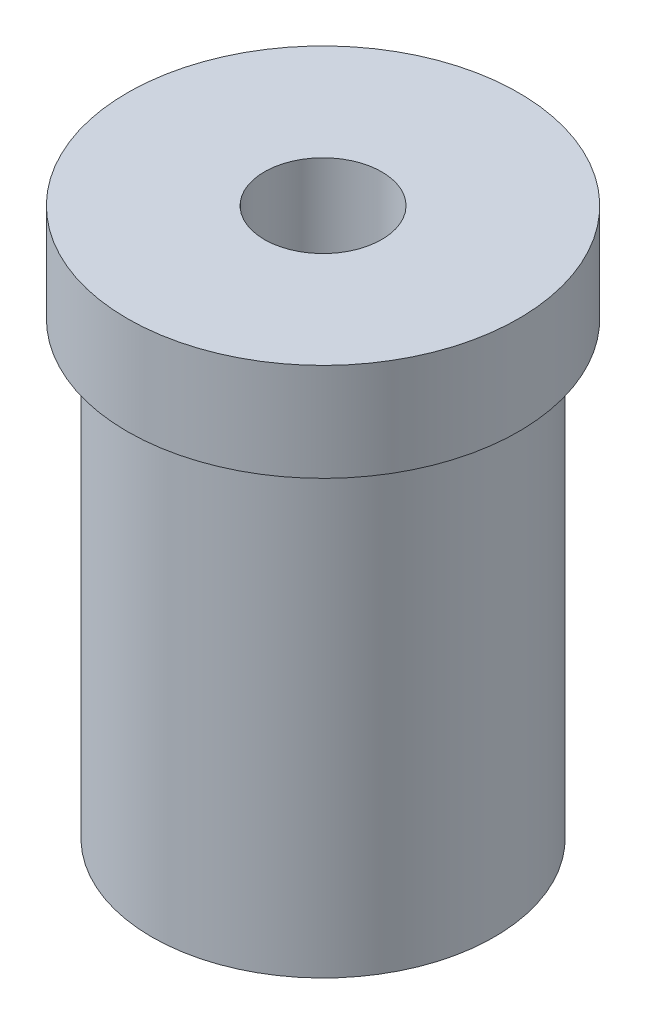
ISO-10303-21;
HEADER;
FILE_DESCRIPTION(('STEP AP214'),'2;1');
FILE_NAME('part.step','',(''),(''),'','','');
FILE_SCHEMA(('AUTOMOTIVE_DESIGN { 1 0 10303 214 1 1 1 1 }'));
ENDSEC;
DATA;
#1=APPLICATION_CONTEXT('core data for automotive mechanical design processes');
#2=APPLICATION_PROTOCOL_DEFINITION('international standard','automotive_design',2000,#1);
#3=PRODUCT_CONTEXT('',#1,'mechanical');
#4=PRODUCT('Part','Part','',(#3));
#5=PRODUCT_RELATED_PRODUCT_CATEGORY('part','',(#4));
#6=PRODUCT_DEFINITION_FORMATION('','',#4);
#7=PRODUCT_DEFINITION_CONTEXT('part definition',#1,'design');
#8=PRODUCT_DEFINITION('design','',#6,#7);
#9=PRODUCT_DEFINITION_SHAPE('','',#8);
#10=(LENGTH_UNIT() NAMED_UNIT(*) SI_UNIT(.MILLI.,.METRE.));
#11=(NAMED_UNIT(*) PLANE_ANGLE_UNIT() SI_UNIT($,.RADIAN.));
#12=(NAMED_UNIT(*) SI_UNIT($,.STERADIAN.) SOLID_ANGLE_UNIT());
#13=UNCERTAINTY_MEASURE_WITH_UNIT(LENGTH_MEASURE(1.E-05),#10,'distance_accuracy_value','');
#14=(GEOMETRIC_REPRESENTATION_CONTEXT(3) GLOBAL_UNCERTAINTY_ASSIGNED_CONTEXT((#13)) GLOBAL_UNIT_ASSIGNED_CONTEXT((#10,
#11,#12)) REPRESENTATION_CONTEXT('',''));
#15=CARTESIAN_POINT('',(0.,0.,0.));
#16=DIRECTION('',(0.,0.,1.));
#17=DIRECTION('',(1.,0.,0.));
#18=AXIS2_PLACEMENT_3D('',#15,#16,#17);
#19=CARTESIAN_POINT('',(0.,-0.800000000000002,0.));
#20=DIRECTION('',(0.,1.,0.));
#21=DIRECTION('',(0.,0.,1.));
#22=AXIS2_PLACEMENT_3D('',#19,#20,#21);
#23=CYLINDRICAL_SURFACE('',#22,1.2);
#24=CARTESIAN_POINT('',(0.,11.2,0.));
#25=DIRECTION('',(0.,1.,0.));
#26=DIRECTION('',(0.,0.,1.));
#27=AXIS2_PLACEMENT_3D('',#24,#25,#26);
#28=CIRCLE('',#27,1.2);
#29=CARTESIAN_POINT('',(0.,11.2,1.2));
#30=VERTEX_POINT('',#29);
#31=EDGE_CURVE('E19',#30,#30,#28,.F.);
#32=ORIENTED_EDGE('',*,*,#31,.F.);
#33=EDGE_LOOP('',(#32));
#34=FACE_BOUND('',#33,.T.);
#35=CARTESIAN_POINT('',(0.,5.,0.));
#36=DIRECTION('',(0.,1.,0.));
#37=DIRECTION('',(0.,0.,1.));
#38=AXIS2_PLACEMENT_3D('',#35,#36,#37);
#39=CIRCLE('',#38,1.2);
#40=CARTESIAN_POINT('',(0.,5.,1.2));
#41=VERTEX_POINT('',#40);
#42=EDGE_CURVE('E41',#41,#41,#39,.T.);
#43=ORIENTED_EDGE('',*,*,#42,.F.);
#44=EDGE_LOOP('',(#43));
#45=FACE_BOUND('',#44,.T.);
#46=ADVANCED_FACE('F15',(#34,#45),#23,.F.);
#47=CARTESIAN_POINT('',(0.,11.2,0.));
#48=DIRECTION('',(0.,1.,0.));
#49=DIRECTION('',(0.,0.,1.));
#50=AXIS2_PLACEMENT_3D('',#47,#48,#49);
#51=PLANE('',#50);
#52=CARTESIAN_POINT('',(0.,11.2,0.));
#53=DIRECTION('',(0.,1.,0.));
#54=DIRECTION('',(0.,0.,1.));
#55=AXIS2_PLACEMENT_3D('',#52,#53,#54);
#56=CIRCLE('',#55,4.);
#57=CARTESIAN_POINT('',(0.,11.2,4.));
#58=VERTEX_POINT('',#57);
#59=EDGE_CURVE('E39',#58,#58,#56,.F.);
#60=ORIENTED_EDGE('',*,*,#59,.F.);
#61=EDGE_LOOP('',(#60));
#62=FACE_BOUND('',#61,.T.);
#63=ORIENTED_EDGE('',*,*,#31,.T.);
#64=EDGE_LOOP('',(#63));
#65=FACE_BOUND('',#64,.T.);
#66=ADVANCED_FACE('F48',(#62,#65),#51,.T.);
#67=CARTESIAN_POINT('',(0.,5.,0.));
#68=DIRECTION('',(0.,-1.,0.));
#69=DIRECTION('',(0.,0.,-1.));
#70=AXIS2_PLACEMENT_3D('',#67,#68,#69);
#71=PLANE('',#70);
#72=ORIENTED_EDGE('',*,*,#42,.T.);
#73=EDGE_LOOP('',(#72));
#74=FACE_BOUND('',#73,.T.);
#75=CARTESIAN_POINT('',(0.,5.,0.));
#76=DIRECTION('',(0.,-1.,0.));
#77=DIRECTION('',(0.,0.,-1.));
#78=AXIS2_PLACEMENT_3D('',#75,#76,#77);
#79=CIRCLE('',#78,2.5);
#80=CARTESIAN_POINT('',(0.,5.,-2.5));
#81=VERTEX_POINT('',#80);
#82=EDGE_CURVE('E36',#81,#81,#79,.T.);
#83=ORIENTED_EDGE('',*,*,#82,.T.);
#84=EDGE_LOOP('',(#83));
#85=FACE_BOUND('',#84,.T.);
#86=ADVANCED_FACE('F57',(#74,#85),#71,.T.);
#87=CARTESIAN_POINT('',(0.,9.2,0.));
#88=DIRECTION('',(0.,1.,0.));
#89=DIRECTION('',(0.,0.,1.));
#90=AXIS2_PLACEMENT_3D('',#87,#88,#89);
#91=CYLINDRICAL_SURFACE('',#90,4.);
#92=ORIENTED_EDGE('',*,*,#59,.T.);
#93=EDGE_LOOP('',(#92));
#94=FACE_BOUND('',#93,.T.);
#95=CARTESIAN_POINT('',(0.,9.2,0.));
#96=DIRECTION('',(0.,1.,0.));
#97=DIRECTION('',(0.,0.,1.));
#98=AXIS2_PLACEMENT_3D('',#95,#96,#97);
#99=CIRCLE('',#98,4.);
#100=CARTESIAN_POINT('',(0.,9.2,4.));
#101=VERTEX_POINT('',#100);
#102=EDGE_CURVE('E33',#101,#101,#99,.T.);
#103=ORIENTED_EDGE('',*,*,#102,.T.);
#104=EDGE_LOOP('',(#103));
#105=FACE_BOUND('',#104,.T.);
#106=ADVANCED_FACE('F76',(#94,#105),#91,.T.);
#107=CARTESIAN_POINT('',(0.,5.,0.));
#108=DIRECTION('',(0.,-1.,0.));
#109=DIRECTION('',(0.,0.,-1.));
#110=AXIS2_PLACEMENT_3D('',#107,#108,#109);
#111=CYLINDRICAL_SURFACE('',#110,2.5);
#112=ORIENTED_EDGE('',*,*,#82,.F.);
#113=EDGE_LOOP('',(#112));
#114=FACE_BOUND('',#113,.T.);
#115=CARTESIAN_POINT('',(0.,0.,0.));
#116=DIRECTION('',(0.,-1.,0.));
#117=DIRECTION('',(0.,0.,-1.));
#118=AXIS2_PLACEMENT_3D('',#115,#116,#117);
#119=CIRCLE('',#118,2.5);
#120=CARTESIAN_POINT('',(0.,0.,-2.5));
#121=VERTEX_POINT('',#120);
#122=EDGE_CURVE('E28',#121,#121,#119,.T.);
#123=ORIENTED_EDGE('',*,*,#122,.T.);
#124=EDGE_LOOP('',(#123));
#125=FACE_BOUND('',#124,.T.);
#126=ADVANCED_FACE('F72',(#114,#125),#111,.F.);
#127=CARTESIAN_POINT('',(0.,9.2,0.));
#128=DIRECTION('',(0.,1.,0.));
#129=DIRECTION('',(0.,0.,1.));
#130=AXIS2_PLACEMENT_3D('',#127,#128,#129);
#131=PLANE('',#130);
#132=CARTESIAN_POINT('',(0.,9.2,0.));
#133=DIRECTION('',(0.,-1.,0.));
#134=DIRECTION('',(0.,0.,-1.));
#135=AXIS2_PLACEMENT_3D('',#132,#133,#134);
#136=CIRCLE('',#135,3.5);
#137=CARTESIAN_POINT('',(0.,9.2,-3.5));
#138=VERTEX_POINT('',#137);
#139=EDGE_CURVE('E23',#138,#138,#136,.T.);
#140=ORIENTED_EDGE('',*,*,#139,.F.);
#141=EDGE_LOOP('',(#140));
#142=FACE_BOUND('',#141,.T.);
#143=ORIENTED_EDGE('',*,*,#102,.F.);
#144=EDGE_LOOP('',(#143));
#145=FACE_BOUND('',#144,.T.);
#146=ADVANCED_FACE('F65',(#142,#145),#131,.F.);
#147=CARTESIAN_POINT('',(0.,0.,0.));
#148=DIRECTION('',(0.,1.,0.));
#149=DIRECTION('',(0.,0.,1.));
#150=AXIS2_PLACEMENT_3D('',#147,#148,#149);
#151=PLANE('',#150);
#152=CARTESIAN_POINT('',(0.,0.,0.));
#153=DIRECTION('',(0.,-1.,0.));
#154=DIRECTION('',(0.,0.,-1.));
#155=AXIS2_PLACEMENT_3D('',#152,#153,#154);
#156=CIRCLE('',#155,3.5);
#157=CARTESIAN_POINT('',(0.,0.,-3.5));
#158=VERTEX_POINT('',#157);
#159=EDGE_CURVE('E10',#158,#158,#156,.F.);
#160=ORIENTED_EDGE('',*,*,#159,.F.);
#161=EDGE_LOOP('',(#160));
#162=FACE_BOUND('',#161,.T.);
#163=ORIENTED_EDGE('',*,*,#122,.F.);
#164=EDGE_LOOP('',(#163));
#165=FACE_BOUND('',#164,.T.);
#166=ADVANCED_FACE('F61',(#162,#165),#151,.F.);
#167=CARTESIAN_POINT('',(0.,11.2,0.));
#168=DIRECTION('',(0.,-1.,0.));
#169=DIRECTION('',(0.,0.,-1.));
#170=AXIS2_PLACEMENT_3D('',#167,#168,#169);
#171=CYLINDRICAL_SURFACE('',#170,3.5);
#172=ORIENTED_EDGE('',*,*,#159,.T.);
#173=EDGE_LOOP('',(#172));
#174=FACE_BOUND('',#173,.T.);
#175=ORIENTED_EDGE('',*,*,#139,.T.);
#176=EDGE_LOOP('',(#175));
#177=FACE_BOUND('',#176,.T.);
#178=ADVANCED_FACE('F17',(#174,#177),#171,.T.);
#179=CLOSED_SHELL('',(#46,#66,#86,#106,#126,#146,#166,#178));
#180=MANIFOLD_SOLID_BREP('B1',#179);
#181=ADVANCED_BREP_SHAPE_REPRESENTATION('',(#18,#180),#14);
#182=SHAPE_DEFINITION_REPRESENTATION(#9,#181);
ENDSEC;
END-ISO-10303-21;
